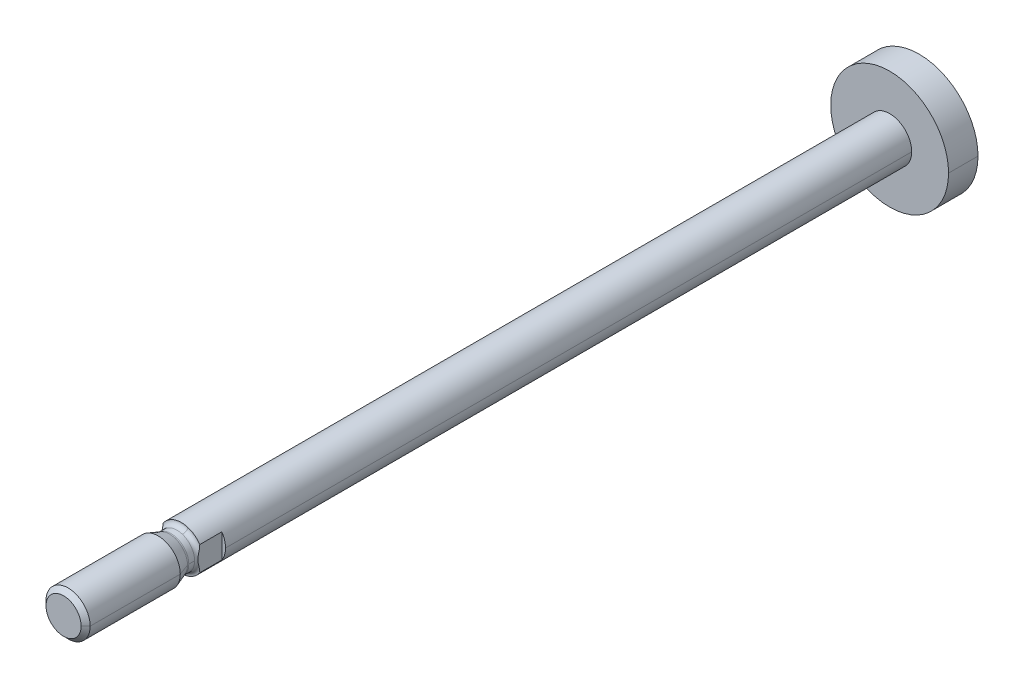
ISO-10303-21;
HEADER;
FILE_DESCRIPTION(('STEP AP214'),'2;1');
FILE_NAME('part.step','',(''),(''),'','','');
FILE_SCHEMA(('AUTOMOTIVE_DESIGN { 1 0 10303 214 1 1 1 1 }'));
ENDSEC;
DATA;
#1=APPLICATION_CONTEXT('core data for automotive mechanical design processes');
#2=APPLICATION_PROTOCOL_DEFINITION('international standard','automotive_design',2000,#1);
#3=PRODUCT_CONTEXT('',#1,'mechanical');
#4=PRODUCT('Part','Part','',(#3));
#5=PRODUCT_RELATED_PRODUCT_CATEGORY('part','',(#4));
#6=PRODUCT_DEFINITION_FORMATION('','',#4);
#7=PRODUCT_DEFINITION_CONTEXT('part definition',#1,'design');
#8=PRODUCT_DEFINITION('design','',#6,#7);
#9=PRODUCT_DEFINITION_SHAPE('','',#8);
#10=(LENGTH_UNIT() NAMED_UNIT(*) SI_UNIT(.MILLI.,.METRE.));
#11=(NAMED_UNIT(*) PLANE_ANGLE_UNIT() SI_UNIT($,.RADIAN.));
#12=(NAMED_UNIT(*) SI_UNIT($,.STERADIAN.) SOLID_ANGLE_UNIT());
#13=UNCERTAINTY_MEASURE_WITH_UNIT(LENGTH_MEASURE(1.E-05),#10,'distance_accuracy_value','');
#14=(GEOMETRIC_REPRESENTATION_CONTEXT(3) GLOBAL_UNCERTAINTY_ASSIGNED_CONTEXT((#13)) GLOBAL_UNIT_ASSIGNED_CONTEXT((#10,
#11,#12)) REPRESENTATION_CONTEXT('',''));
#15=CARTESIAN_POINT('',(0.,0.,0.));
#16=DIRECTION('',(0.,0.,1.));
#17=DIRECTION('',(1.,0.,0.));
#18=AXIS2_PLACEMENT_3D('',#15,#16,#17);
#19=CARTESIAN_POINT('',(0.,0.,-95.2));
#20=DIRECTION('',(0.,0.,-1.));
#21=DIRECTION('',(0.,1.,0.));
#22=AXIS2_PLACEMENT_3D('',#19,#20,#21);
#23=CYLINDRICAL_SURFACE('',#22,3.);
#24=DIRECTION('',(0.,0.,-1.));
#25=VECTOR('',#24,1.);
#26=CARTESIAN_POINT('',(3.,0.,2.));
#27=LINE('',#26,#25);
#28=CARTESIAN_POINT('',(3.,0.,2.));
#29=VERTEX_POINT('',#28);
#30=CARTESIAN_POINT('',(3.,0.,-91.2));
#31=VERTEX_POINT('',#30);
#32=EDGE_CURVE('E11',#29,#31,#27,.T.);
#33=ORIENTED_EDGE('',*,*,#32,.F.);
#34=CARTESIAN_POINT('',(0.,0.,2.));
#35=DIRECTION('',(0.,0.,1.));
#36=DIRECTION('',(1.,0.,0.));
#37=AXIS2_PLACEMENT_3D('',#34,#35,#36);
#38=CIRCLE('',#37,3.);
#39=CARTESIAN_POINT('',(2.5,-1.6583123951777,2.));
#40=VERTEX_POINT('',#39);
#41=EDGE_CURVE('E24',#40,#29,#38,.T.);
#42=ORIENTED_EDGE('',*,*,#41,.F.);
#43=DIRECTION('',(0.,0.,-1.));
#44=VECTOR('',#43,1.);
#45=CARTESIAN_POINT('',(2.5,-1.6583123951777,-95.2));
#46=LINE('',#45,#44);
#47=CARTESIAN_POINT('',(2.5,-1.65831239517778,4.99999999999909));
#48=VERTEX_POINT('',#47);
#49=EDGE_CURVE('E450',#48,#40,#46,.T.);
#50=ORIENTED_EDGE('',*,*,#49,.F.);
#51=CARTESIAN_POINT('',(0.,0.,5.));
#52=DIRECTION('',(0.,0.,-1.));
#53=DIRECTION('',(-1.,0.,0.));
#54=AXIS2_PLACEMENT_3D('',#51,#52,#53);
#55=CIRCLE('',#54,3.);
#56=CARTESIAN_POINT('',(-0.927050983124873,-2.85316954888556,5.));
#57=VERTEX_POINT('',#56);
#58=EDGE_CURVE('E446',#48,#57,#55,.T.);
#59=ORIENTED_EDGE('',*,*,#58,.T.);
#60=CARTESIAN_POINT('',(0.,0.,5.));
#61=DIRECTION('',(0.,0.,-1.));
#62=DIRECTION('',(-1.,0.,0.));
#63=AXIS2_PLACEMENT_3D('',#60,#61,#62);
#64=CIRCLE('',#63,3.);
#65=CARTESIAN_POINT('',(-2.5,-1.6583123951777,5.));
#66=VERTEX_POINT('',#65);
#67=EDGE_CURVE('E442',#57,#66,#64,.T.);
#68=ORIENTED_EDGE('',*,*,#67,.T.);
#69=DIRECTION('',(0.,0.,1.));
#70=VECTOR('',#69,1.);
#71=CARTESIAN_POINT('',(-2.5,-1.6583123951777,-95.2));
#72=LINE('',#71,#70);
#73=CARTESIAN_POINT('',(-2.5,-1.6583123951777,2.));
#74=VERTEX_POINT('',#73);
#75=EDGE_CURVE('E438',#74,#66,#72,.T.);
#76=ORIENTED_EDGE('',*,*,#75,.F.);
#77=CARTESIAN_POINT('',(0.,0.,2.));
#78=DIRECTION('',(0.,0.,1.));
#79=DIRECTION('',(1.,0.,0.));
#80=AXIS2_PLACEMENT_3D('',#77,#78,#79);
#81=CIRCLE('',#80,3.);
#82=CARTESIAN_POINT('',(-3.,0.,2.));
#83=VERTEX_POINT('',#82);
#84=EDGE_CURVE('E433',#83,#74,#81,.T.);
#85=ORIENTED_EDGE('',*,*,#84,.F.);
#86=DIRECTION('',(0.,0.,-1.));
#87=VECTOR('',#86,1.);
#88=CARTESIAN_POINT('',(-3.,0.,2.));
#89=LINE('',#88,#87);
#90=CARTESIAN_POINT('',(-3.,0.,-91.2));
#91=VERTEX_POINT('',#90);
#92=EDGE_CURVE('E429',#83,#91,#89,.T.);
#93=ORIENTED_EDGE('',*,*,#92,.T.);
#94=CARTESIAN_POINT('',(0.,0.,-91.2));
#95=DIRECTION('',(0.,0.,-1.));
#96=DIRECTION('',(-1.,0.,0.));
#97=AXIS2_PLACEMENT_3D('',#94,#95,#96);
#98=CIRCLE('',#97,3.);
#99=EDGE_CURVE('E424',#31,#91,#98,.T.);
#100=ORIENTED_EDGE('',*,*,#99,.F.);
#101=EDGE_LOOP('',(#33,#42,#50,#59,#68,#76,#85,#93,#100));
#102=FACE_BOUND('',#101,.T.);
#103=ADVANCED_FACE('F16',(#102),#23,.T.);
#104=CARTESIAN_POINT('',(0.,3.,-91.2));
#105=DIRECTION('',(0.,0.,-1.));
#106=DIRECTION('',(-1.,0.,0.));
#107=AXIS2_PLACEMENT_3D('',#104,#105,#106);
#108=PLANE('',#107);
#109=CARTESIAN_POINT('',(0.,0.,-91.2));
#110=DIRECTION('',(0.,0.,-1.));
#111=DIRECTION('',(-1.,0.,0.));
#112=AXIS2_PLACEMENT_3D('',#109,#110,#111);
#113=CIRCLE('',#112,8.);
#114=CARTESIAN_POINT('',(8.,0.,-91.2));
#115=VERTEX_POINT('',#114);
#116=CARTESIAN_POINT('',(-8.,0.,-91.2));
#117=VERTEX_POINT('',#116);
#118=EDGE_CURVE('E152',#115,#117,#113,.T.);
#119=ORIENTED_EDGE('',*,*,#118,.F.);
#120=CARTESIAN_POINT('',(0.,0.,-91.2));
#121=DIRECTION('',(0.,0.,-1.));
#122=DIRECTION('',(-1.,0.,0.));
#123=AXIS2_PLACEMENT_3D('',#120,#121,#122);
#124=CIRCLE('',#123,8.);
#125=EDGE_CURVE('E417',#117,#115,#124,.T.);
#126=ORIENTED_EDGE('',*,*,#125,.F.);
#127=EDGE_LOOP('',(#119,#126));
#128=FACE_BOUND('',#127,.T.);
#129=CARTESIAN_POINT('',(0.,0.,-91.2));
#130=DIRECTION('',(0.,0.,-1.));
#131=DIRECTION('',(-1.,0.,0.));
#132=AXIS2_PLACEMENT_3D('',#129,#130,#131);
#133=CIRCLE('',#132,3.);
#134=EDGE_CURVE('E412',#91,#31,#133,.T.);
#135=ORIENTED_EDGE('',*,*,#134,.T.);
#136=ORIENTED_EDGE('',*,*,#99,.T.);
#137=EDGE_LOOP('',(#135,#136));
#138=FACE_BOUND('',#137,.T.);
#139=ADVANCED_FACE('F481',(#128,#138),#108,.F.);
#140=CARTESIAN_POINT('',(0.,0.,-95.2));
#141=DIRECTION('',(0.,0.,-1.));
#142=DIRECTION('',(0.,-1.,0.));
#143=AXIS2_PLACEMENT_3D('',#140,#141,#142);
#144=CYLINDRICAL_SURFACE('',#143,3.);
#145=ORIENTED_EDGE('',*,*,#32,.T.);
#146=ORIENTED_EDGE('',*,*,#134,.F.);
#147=ORIENTED_EDGE('',*,*,#92,.F.);
#148=CARTESIAN_POINT('',(0.,0.,2.));
#149=DIRECTION('',(0.,0.,1.));
#150=DIRECTION('',(1.,0.,0.));
#151=AXIS2_PLACEMENT_3D('',#148,#149,#150);
#152=CIRCLE('',#151,3.);
#153=CARTESIAN_POINT('',(-2.5,1.6583123951777,2.));
#154=VERTEX_POINT('',#153);
#155=EDGE_CURVE('E407',#154,#83,#152,.T.);
#156=ORIENTED_EDGE('',*,*,#155,.F.);
#157=DIRECTION('',(0.,0.,-1.));
#158=VECTOR('',#157,1.);
#159=CARTESIAN_POINT('',(-2.5,1.6583123951777,-95.2));
#160=LINE('',#159,#158);
#161=CARTESIAN_POINT('',(-2.5,1.65831239517778,4.99999999999909));
#162=VERTEX_POINT('',#161);
#163=EDGE_CURVE('E402',#162,#154,#160,.T.);
#164=ORIENTED_EDGE('',*,*,#163,.F.);
#165=CARTESIAN_POINT('',(0.,0.,5.));
#166=DIRECTION('',(0.,0.,-1.));
#167=DIRECTION('',(-1.,0.,0.));
#168=AXIS2_PLACEMENT_3D('',#165,#166,#167);
#169=CIRCLE('',#168,3.);
#170=CARTESIAN_POINT('',(0.927050983124873,2.85316954888556,5.));
#171=VERTEX_POINT('',#170);
#172=EDGE_CURVE('E398',#162,#171,#169,.T.);
#173=ORIENTED_EDGE('',*,*,#172,.T.);
#174=CARTESIAN_POINT('',(0.,0.,5.));
#175=DIRECTION('',(0.,0.,-1.));
#176=DIRECTION('',(-1.,0.,0.));
#177=AXIS2_PLACEMENT_3D('',#174,#175,#176);
#178=CIRCLE('',#177,3.);
#179=CARTESIAN_POINT('',(2.5,1.6583123951777,5.));
#180=VERTEX_POINT('',#179);
#181=EDGE_CURVE('E394',#171,#180,#178,.T.);
#182=ORIENTED_EDGE('',*,*,#181,.T.);
#183=DIRECTION('',(0.,0.,1.));
#184=VECTOR('',#183,1.);
#185=CARTESIAN_POINT('',(2.5,1.6583123951777,-95.2));
#186=LINE('',#185,#184);
#187=CARTESIAN_POINT('',(2.5,1.6583123951777,2.));
#188=VERTEX_POINT('',#187);
#189=EDGE_CURVE('E390',#188,#180,#186,.T.);
#190=ORIENTED_EDGE('',*,*,#189,.F.);
#191=CARTESIAN_POINT('',(0.,0.,2.));
#192=DIRECTION('',(0.,0.,1.));
#193=DIRECTION('',(1.,0.,0.));
#194=AXIS2_PLACEMENT_3D('',#191,#192,#193);
#195=CIRCLE('',#194,3.);
#196=EDGE_CURVE('E385',#29,#188,#195,.T.);
#197=ORIENTED_EDGE('',*,*,#196,.F.);
#198=EDGE_LOOP('',(#145,#146,#147,#156,#164,#173,#182,#190,#197));
#199=FACE_BOUND('',#198,.T.);
#200=ADVANCED_FACE('F474',(#199),#144,.T.);
#201=CARTESIAN_POINT('',(0.,0.,2.));
#202=DIRECTION('',(0.,0.,1.));
#203=DIRECTION('',(1.,0.,0.));
#204=AXIS2_PLACEMENT_3D('',#201,#202,#203);
#205=PLANE('',#204);
#206=ORIENTED_EDGE('',*,*,#41,.T.);
#207=ORIENTED_EDGE('',*,*,#196,.T.);
#208=DIRECTION('',(0.,-1.,0.));
#209=VECTOR('',#208,1.);
#210=CARTESIAN_POINT('',(2.5,5.,2.));
#211=LINE('',#210,#209);
#212=EDGE_CURVE('E383',#188,#40,#211,.T.);
#213=ORIENTED_EDGE('',*,*,#212,.T.);
#214=EDGE_LOOP('',(#206,#207,#213));
#215=FACE_BOUND('',#214,.T.);
#216=ADVANCED_FACE('F363',(#215),#205,.T.);
#217=CARTESIAN_POINT('',(2.5,5.,6.));
#218=DIRECTION('',(1.,0.,0.));
#219=DIRECTION('',(0.,0.,-1.));
#220=AXIS2_PLACEMENT_3D('',#217,#218,#219);
#221=PLANE('',#220);
#222=ORIENTED_EDGE('',*,*,#49,.T.);
#223=ORIENTED_EDGE('',*,*,#212,.F.);
#224=ORIENTED_EDGE('',*,*,#189,.T.);
#225=CARTESIAN_POINT('',(2.5,1.6583123951777,5.));
#226=CARTESIAN_POINT('',(2.5,1.6350853906018,5.));
#227=CARTESIAN_POINT('',(2.5,1.61134396976878,5.00042391384695));
#228=CARTESIAN_POINT('',(2.5,1.31995088317273,5.01039632288625));
#229=CARTESIAN_POINT('',(2.5,1.0546739886757,5.06947150687412));
#230=CARTESIAN_POINT('',(2.5,0.663610870080661,5.16505629469338));
#231=CARTESIAN_POINT('',(2.5,0.532754423731142,5.1985693479185));
#232=CARTESIAN_POINT('',(2.5,0.269363705074703,5.25058170125349));
#233=CARTESIAN_POINT('',(2.5,0.1342385521877,5.26833752096453));
#234=CARTESIAN_POINT('',(2.5,-0.204088018553089,5.26833752096453));
#235=CARTESIAN_POINT('',(2.5,-0.407251135882582,5.22666008858174));
#236=CARTESIAN_POINT('',(2.5,-0.778743109144786,5.13776197891482));
#237=CARTESIAN_POINT('',(2.5,-0.952101118417445,5.09236773275344));
#238=CARTESIAN_POINT('',(2.5,-1.30127295970227,5.02408836105807));
#239=CARTESIAN_POINT('',(2.5,-1.48041983817683,4.99999999999909));
#240=CARTESIAN_POINT('',(2.5,-1.65831239517778,4.99999999999909));
#241=B_SPLINE_CURVE_WITH_KNOTS('',3,(#225,#226,#227,#228,#229,#230,#231,#232,#233,#234,#235,
#236,#237,#238,#239,#240),.UNSPECIFIED.,.F.,.F.,(4,2,2,2,2,2,2,4),(0.,0.0207399910045407,
0.260344724761913,0.380209787677685,0.500074850593456,0.682310302224486,0.841155151112243,1.),.UNSPECIFIED.);
#242=EDGE_CURVE('E381',#180,#48,#241,.T.);
#243=ORIENTED_EDGE('',*,*,#242,.T.);
#244=EDGE_LOOP('',(#222,#223,#224,#243));
#245=FACE_BOUND('',#244,.T.);
#246=ADVANCED_FACE('F358',(#245),#221,.T.);
#247=CARTESIAN_POINT('',(0.,0.,5.6000000000001));
#248=DIRECTION('',(0.,0.,-1.));
#249=DIRECTION('',(-0.951056516295154,0.309016994374947,0.));
#250=AXIS2_PLACEMENT_3D('',#247,#248,#249);
#251=TOROIDAL_SURFACE('',#250,3.0000000000001,0.600000000000099);
#252=CARTESIAN_POINT('',(-0.927050983124873,-2.85316954888556,5.6000000000001));
#253=DIRECTION('',(-0.951056516295154,0.309016994374947,0.));
#254=DIRECTION('',(0.309016994374947,0.951056516295154,-1.68753899742996E-13));
#255=AXIS2_PLACEMENT_3D('',#252,#253,#254);
#256=CIRCLE('',#255,0.600000000000099);
#257=CARTESIAN_POINT('',(-0.741640786499874,-2.28253563910837,5.6));
#258=VERTEX_POINT('',#257);
#259=EDGE_CURVE('E341',#258,#57,#256,.T.);
#260=ORIENTED_EDGE('',*,*,#259,.T.);
#261=ORIENTED_EDGE('',*,*,#58,.F.);
#262=ORIENTED_EDGE('',*,*,#242,.F.);
#263=ORIENTED_EDGE('',*,*,#181,.F.);
#264=CARTESIAN_POINT('',(0.927050983124873,2.85316954888556,5.6000000000001));
#265=DIRECTION('',(0.951056516295154,-0.309016994374947,0.));
#266=DIRECTION('',(-0.309016994374947,-0.951056516295154,-1.68753899742996E-13));
#267=AXIS2_PLACEMENT_3D('',#264,#265,#266);
#268=CIRCLE('',#267,0.600000000000099);
#269=CARTESIAN_POINT('',(0.741640786499874,2.28253563910837,5.6));
#270=VERTEX_POINT('',#269);
#271=EDGE_CURVE('E336',#270,#171,#268,.T.);
#272=ORIENTED_EDGE('',*,*,#271,.F.);
#273=CARTESIAN_POINT('',(0.,0.,5.6));
#274=DIRECTION('',(0.,0.,-1.));
#275=DIRECTION('',(-1.,0.,0.));
#276=AXIS2_PLACEMENT_3D('',#273,#274,#275);
#277=CIRCLE('',#276,2.4);
#278=CARTESIAN_POINT('',(2.4,0.,5.6));
#279=VERTEX_POINT('',#278);
#280=EDGE_CURVE('E332',#270,#279,#277,.T.);
#281=ORIENTED_EDGE('',*,*,#280,.T.);
#282=CARTESIAN_POINT('',(0.,0.,5.6));
#283=DIRECTION('',(0.,0.,-1.));
#284=DIRECTION('',(-1.,0.,0.));
#285=AXIS2_PLACEMENT_3D('',#282,#283,#284);
#286=CIRCLE('',#285,2.4);
#287=EDGE_CURVE('E328',#279,#258,#286,.T.);
#288=ORIENTED_EDGE('',*,*,#287,.T.);
#289=EDGE_LOOP('',(#260,#261,#262,#263,#272,#281,#288));
#290=FACE_BOUND('',#289,.T.);
#291=ADVANCED_FACE('F349',(#290),#251,.F.);
#292=CARTESIAN_POINT('',(0.,0.,4.));
#293=DIRECTION('',(0.,0.,-1.));
#294=DIRECTION('',(0.,1.,0.));
#295=AXIS2_PLACEMENT_3D('',#292,#293,#294);
#296=CYLINDRICAL_SURFACE('',#295,2.4);
#297=DIRECTION('',(0.,0.,-1.));
#298=VECTOR('',#297,1.);
#299=CARTESIAN_POINT('',(2.4,0.,6.3942038115749));
#300=LINE('',#299,#298);
#301=CARTESIAN_POINT('',(2.4,0.,6.3942038115749));
#302=VERTEX_POINT('',#301);
#303=EDGE_CURVE('E323',#302,#279,#300,.T.);
#304=ORIENTED_EDGE('',*,*,#303,.F.);
#305=CARTESIAN_POINT('',(0.,0.,6.3942038115749));
#306=DIRECTION('',(0.,0.,-1.));
#307=DIRECTION('',(-1.,0.,0.));
#308=AXIS2_PLACEMENT_3D('',#305,#306,#307);
#309=CIRCLE('',#308,2.4);
#310=CARTESIAN_POINT('',(-0.741640786499874,-2.28253563910837,6.3942038115749));
#311=VERTEX_POINT('',#310);
#312=EDGE_CURVE('E319',#302,#311,#309,.T.);
#313=ORIENTED_EDGE('',*,*,#312,.T.);
#314=CARTESIAN_POINT('',(0.,0.,6.3942038115749));
#315=DIRECTION('',(0.,0.,-1.));
#316=DIRECTION('',(-1.,0.,0.));
#317=AXIS2_PLACEMENT_3D('',#314,#315,#316);
#318=CIRCLE('',#317,2.4);
#319=CARTESIAN_POINT('',(-2.4,0.,6.3942038115749));
#320=VERTEX_POINT('',#319);
#321=EDGE_CURVE('E315',#311,#320,#318,.T.);
#322=ORIENTED_EDGE('',*,*,#321,.T.);
#323=DIRECTION('',(0.,0.,-1.));
#324=VECTOR('',#323,1.);
#325=CARTESIAN_POINT('',(-2.4,0.,6.3942038115749));
#326=LINE('',#325,#324);
#327=CARTESIAN_POINT('',(-2.4,0.,5.6));
#328=VERTEX_POINT('',#327);
#329=EDGE_CURVE('E311',#320,#328,#326,.T.);
#330=ORIENTED_EDGE('',*,*,#329,.T.);
#331=CARTESIAN_POINT('',(0.,0.,5.6));
#332=DIRECTION('',(0.,0.,-1.));
#333=DIRECTION('',(-1.,0.,0.));
#334=AXIS2_PLACEMENT_3D('',#331,#332,#333);
#335=CIRCLE('',#334,2.4);
#336=EDGE_CURVE('E306',#258,#328,#335,.T.);
#337=ORIENTED_EDGE('',*,*,#336,.F.);
#338=ORIENTED_EDGE('',*,*,#287,.F.);
#339=EDGE_LOOP('',(#304,#313,#322,#330,#337,#338));
#340=FACE_BOUND('',#339,.T.);
#341=ADVANCED_FACE('F283',(#340),#296,.T.);
#342=CARTESIAN_POINT('',(0.,0.,5.6000000000001));
#343=DIRECTION('',(0.,0.,-1.));
#344=DIRECTION('',(0.951056516295154,-0.309016994374947,0.));
#345=AXIS2_PLACEMENT_3D('',#342,#343,#344);
#346=TOROIDAL_SURFACE('',#345,3.0000000000001,0.600000000000099);
#347=ORIENTED_EDGE('',*,*,#259,.F.);
#348=ORIENTED_EDGE('',*,*,#336,.T.);
#349=CARTESIAN_POINT('',(0.,0.,5.6));
#350=DIRECTION('',(0.,0.,-1.));
#351=DIRECTION('',(-1.,0.,0.));
#352=AXIS2_PLACEMENT_3D('',#349,#350,#351);
#353=CIRCLE('',#352,2.4);
#354=EDGE_CURVE('E303',#328,#270,#353,.T.);
#355=ORIENTED_EDGE('',*,*,#354,.T.);
#356=ORIENTED_EDGE('',*,*,#271,.T.);
#357=ORIENTED_EDGE('',*,*,#172,.F.);
#358=CARTESIAN_POINT('',(-2.5,-1.6583123951777,5.));
#359=CARTESIAN_POINT('',(-2.5,-1.6350853906018,5.));
#360=CARTESIAN_POINT('',(-2.5,-1.61134396976878,5.00042391384695));
#361=CARTESIAN_POINT('',(-2.5,-1.31995088317273,5.01039632288625));
#362=CARTESIAN_POINT('',(-2.5,-1.0546739886757,5.06947150687412));
#363=CARTESIAN_POINT('',(-2.5,-0.663610870080661,5.16505629469338));
#364=CARTESIAN_POINT('',(-2.5,-0.532754423731142,5.1985693479185));
#365=CARTESIAN_POINT('',(-2.5,-0.269363705074703,5.25058170125349));
#366=CARTESIAN_POINT('',(-2.5,-0.1342385521877,5.26833752096453));
#367=CARTESIAN_POINT('',(-2.5,0.204088018553089,5.26833752096453));
#368=CARTESIAN_POINT('',(-2.5,0.407251135882582,5.22666008858174));
#369=CARTESIAN_POINT('',(-2.5,0.778743109144786,5.13776197891482));
#370=CARTESIAN_POINT('',(-2.5,0.952101118417445,5.09236773275343));
#371=CARTESIAN_POINT('',(-2.5,1.30127295970227,5.02408836105807));
#372=CARTESIAN_POINT('',(-2.5,1.48041983817683,4.99999999999909));
#373=CARTESIAN_POINT('',(-2.5,1.65831239517777,4.99999999999909));
#374=B_SPLINE_CURVE_WITH_KNOTS('',3,(#358,#359,#360,#361,#362,#363,#364,#365,#366,#367,#368,
#369,#370,#371,#372,#373),.UNSPECIFIED.,.F.,.F.,(4,2,2,2,2,2,2,4),(0.,0.0207399910045407,
0.260344724761913,0.380209787677685,0.500074850593456,0.682310302224486,0.841155151112243,1.),.UNSPECIFIED.);
#375=EDGE_CURVE('E301',#66,#162,#374,.T.);
#376=ORIENTED_EDGE('',*,*,#375,.F.);
#377=ORIENTED_EDGE('',*,*,#67,.F.);
#378=EDGE_LOOP('',(#347,#348,#355,#356,#357,#376,#377));
#379=FACE_BOUND('',#378,.T.);
#380=ADVANCED_FACE('F277',(#379),#346,.F.);
#381=CARTESIAN_POINT('',(-2.5,-5.,6.));
#382=DIRECTION('',(-1.,0.,0.));
#383=DIRECTION('',(0.,0.,1.));
#384=AXIS2_PLACEMENT_3D('',#381,#382,#383);
#385=PLANE('',#384);
#386=ORIENTED_EDGE('',*,*,#163,.T.);
#387=DIRECTION('',(0.,1.,0.));
#388=VECTOR('',#387,1.);
#389=CARTESIAN_POINT('',(-2.5,-5.,2.));
#390=LINE('',#389,#388);
#391=EDGE_CURVE('E257',#74,#154,#390,.T.);
#392=ORIENTED_EDGE('',*,*,#391,.F.);
#393=ORIENTED_EDGE('',*,*,#75,.T.);
#394=ORIENTED_EDGE('',*,*,#375,.T.);
#395=EDGE_LOOP('',(#386,#392,#393,#394));
#396=FACE_BOUND('',#395,.T.);
#397=ADVANCED_FACE('F266',(#396),#385,.T.);
#398=CARTESIAN_POINT('',(0.,0.,2.));
#399=DIRECTION('',(0.,0.,1.));
#400=DIRECTION('',(1.,0.,0.));
#401=AXIS2_PLACEMENT_3D('',#398,#399,#400);
#402=PLANE('',#401);
#403=ORIENTED_EDGE('',*,*,#155,.T.);
#404=ORIENTED_EDGE('',*,*,#84,.T.);
#405=ORIENTED_EDGE('',*,*,#391,.T.);
#406=EDGE_LOOP('',(#403,#404,#405));
#407=FACE_BOUND('',#406,.T.);
#408=ADVANCED_FACE('F276',(#407),#402,.T.);
#409=CARTESIAN_POINT('',(0.,0.,4.));
#410=DIRECTION('',(0.,0.,-1.));
#411=DIRECTION('',(0.,-1.,0.));
#412=AXIS2_PLACEMENT_3D('',#409,#410,#411);
#413=CYLINDRICAL_SURFACE('',#412,2.4);
#414=ORIENTED_EDGE('',*,*,#303,.T.);
#415=ORIENTED_EDGE('',*,*,#280,.F.);
#416=ORIENTED_EDGE('',*,*,#354,.F.);
#417=ORIENTED_EDGE('',*,*,#329,.F.);
#418=CARTESIAN_POINT('',(0.,0.,6.3942038115749));
#419=DIRECTION('',(0.,0.,-1.));
#420=DIRECTION('',(-1.,0.,0.));
#421=AXIS2_PLACEMENT_3D('',#418,#419,#420);
#422=CIRCLE('',#421,2.4);
#423=CARTESIAN_POINT('',(0.741640786499874,2.28253563910837,6.3942038115749));
#424=VERTEX_POINT('',#423);
#425=EDGE_CURVE('E253',#320,#424,#422,.T.);
#426=ORIENTED_EDGE('',*,*,#425,.T.);
#427=CARTESIAN_POINT('',(0.,0.,6.3942038115749));
#428=DIRECTION('',(0.,0.,-1.));
#429=DIRECTION('',(-1.,0.,0.));
#430=AXIS2_PLACEMENT_3D('',#427,#428,#429);
#431=CIRCLE('',#430,2.4);
#432=EDGE_CURVE('E248',#424,#302,#431,.T.);
#433=ORIENTED_EDGE('',*,*,#432,.T.);
#434=EDGE_LOOP('',(#414,#415,#416,#417,#426,#433));
#435=FACE_BOUND('',#434,.T.);
#436=ADVANCED_FACE('F471',(#435),#413,.T.);
#437=CARTESIAN_POINT('',(0.,0.,6.39420381157483));
#438=DIRECTION('',(0.,0.,-1.));
#439=DIRECTION('',(-0.951056516295154,0.309016994374947,0.));
#440=AXIS2_PLACEMENT_3D('',#437,#438,#439);
#441=TOROIDAL_SURFACE('',#440,2.99999999999971,0.599999999999703);
#442=CARTESIAN_POINT('',(-0.927050983124751,-2.85316954888518,6.39420381157483));
#443=DIRECTION('',(-0.951056516295154,0.309016994374947,0.));
#444=DIRECTION('',(0.290380989311547,0.893700790312812,0.342020143325949));
#445=AXIS2_PLACEMENT_3D('',#442,#443,#444);
#446=CIRCLE('',#445,0.599999999999703);
#447=CARTESIAN_POINT('',(-0.752822389537909,-2.31694907469776,6.5994158975703));
#448=VERTEX_POINT('',#447);
#449=EDGE_CURVE('E243',#448,#311,#446,.T.);
#450=ORIENTED_EDGE('',*,*,#449,.T.);
#451=ORIENTED_EDGE('',*,*,#312,.F.);
#452=ORIENTED_EDGE('',*,*,#432,.F.);
#453=CARTESIAN_POINT('',(0.927050983124751,2.85316954888518,6.39420381157483));
#454=DIRECTION('',(0.951056516295154,-0.309016994374947,0.));
#455=DIRECTION('',(-0.290380989311547,-0.893700790312811,0.342020143325951));
#456=AXIS2_PLACEMENT_3D('',#453,#454,#455);
#457=CIRCLE('',#456,0.599999999999703);
#458=CARTESIAN_POINT('',(0.752822389537909,2.31694907469776,6.5994158975703));
#459=VERTEX_POINT('',#458);
#460=EDGE_CURVE('E238',#459,#424,#457,.T.);
#461=ORIENTED_EDGE('',*,*,#460,.F.);
#462=CARTESIAN_POINT('',(0.,0.,6.5994158975703));
#463=DIRECTION('',(0.,0.,-1.));
#464=DIRECTION('',(-1.,0.,0.));
#465=AXIS2_PLACEMENT_3D('',#462,#463,#464);
#466=CIRCLE('',#465,2.4361844275285);
#467=CARTESIAN_POINT('',(2.4361844275285,0.,6.5994158975703));
#468=VERTEX_POINT('',#467);
#469=EDGE_CURVE('E234',#459,#468,#466,.T.);
#470=ORIENTED_EDGE('',*,*,#469,.T.);
#471=CARTESIAN_POINT('',(0.,0.,6.5994158975703));
#472=DIRECTION('',(0.,0.,-1.));
#473=DIRECTION('',(-1.,0.,0.));
#474=AXIS2_PLACEMENT_3D('',#471,#472,#473);
#475=CIRCLE('',#474,2.4361844275285);
#476=EDGE_CURVE('E230',#468,#448,#475,.T.);
#477=ORIENTED_EDGE('',*,*,#476,.T.);
#478=EDGE_LOOP('',(#450,#451,#452,#461,#470,#477));
#479=FACE_BOUND('',#478,.T.);
#480=ADVANCED_FACE('F571',(#479),#441,.F.);
#481=CARTESIAN_POINT('',(0.,0.,8.1484864516728));
#482=DIRECTION('',(0.,0.,1.));
#483=DIRECTION('',(0.,1.,0.));
#484=AXIS2_PLACEMENT_3D('',#481,#482,#483);
#485=CONICAL_SURFACE('',#484,3.,0.349065850398829);
#486=DIRECTION('',(-0.342020143325635,0.,0.939692620785921));
#487=VECTOR('',#486,1.);
#488=CARTESIAN_POINT('',(-2.4361844275285,0.,6.5994158975703));
#489=LINE('',#488,#487);
#490=CARTESIAN_POINT('',(-2.4361844275285,0.,6.5994158975703));
#491=VERTEX_POINT('',#490);
#492=CARTESIAN_POINT('',(-3.,0.,8.1484864516728));
#493=VERTEX_POINT('',#492);
#494=EDGE_CURVE('E225',#491,#493,#489,.T.);
#495=ORIENTED_EDGE('',*,*,#494,.F.);
#496=CARTESIAN_POINT('',(0.,0.,6.5994158975703));
#497=DIRECTION('',(0.,0.,-1.));
#498=DIRECTION('',(-1.,0.,0.));
#499=AXIS2_PLACEMENT_3D('',#496,#497,#498);
#500=CIRCLE('',#499,2.4361844275285);
#501=EDGE_CURVE('E220',#448,#491,#500,.T.);
#502=ORIENTED_EDGE('',*,*,#501,.F.);
#503=ORIENTED_EDGE('',*,*,#476,.F.);
#504=DIRECTION('',(0.342020143325635,0.,0.939692620785921));
#505=VECTOR('',#504,1.);
#506=CARTESIAN_POINT('',(2.4361844275285,0.,6.5994158975703));
#507=LINE('',#506,#505);
#508=CARTESIAN_POINT('',(3.,0.,8.1484864516728));
#509=VERTEX_POINT('',#508);
#510=EDGE_CURVE('E216',#468,#509,#507,.T.);
#511=ORIENTED_EDGE('',*,*,#510,.T.);
#512=CARTESIAN_POINT('',(0.,0.,8.1484864516728));
#513=DIRECTION('',(0.,0.,-1.));
#514=DIRECTION('',(-1.,0.,0.));
#515=AXIS2_PLACEMENT_3D('',#512,#513,#514);
#516=CIRCLE('',#515,3.);
#517=EDGE_CURVE('E212',#509,#493,#516,.T.);
#518=ORIENTED_EDGE('',*,*,#517,.T.);
#519=EDGE_LOOP('',(#495,#502,#503,#511,#518));
#520=FACE_BOUND('',#519,.T.);
#521=ADVANCED_FACE('F580',(#520),#485,.T.);
#522=CARTESIAN_POINT('',(0.,0.,4.));
#523=DIRECTION('',(0.,0.,-1.));
#524=DIRECTION('',(-1.61702923845784E-09,1.,0.));
#525=AXIS2_PLACEMENT_3D('',#522,#523,#524);
#526=CYLINDRICAL_SURFACE('',#525,3.);
#527=DIRECTION('',(0.,0.,-1.));
#528=VECTOR('',#527,1.);
#529=CARTESIAN_POINT('',(3.,0.,20.3865));
#530=LINE('',#529,#528);
#531=CARTESIAN_POINT('',(3.,0.,20.3865));
#532=VERTEX_POINT('',#531);
#533=EDGE_CURVE('E207',#532,#509,#530,.T.);
#534=ORIENTED_EDGE('',*,*,#533,.F.);
#535=CARTESIAN_POINT('',(0.,0.,20.3865));
#536=DIRECTION('',(0.,0.,-1.));
#537=DIRECTION('',(-1.,0.,0.));
#538=AXIS2_PLACEMENT_3D('',#535,#536,#537);
#539=CIRCLE('',#538,3.);
#540=CARTESIAN_POINT('',(-3.,0.,20.3865));
#541=VERTEX_POINT('',#540);
#542=EDGE_CURVE('E203',#532,#541,#539,.T.);
#543=ORIENTED_EDGE('',*,*,#542,.T.);
#544=DIRECTION('',(0.,0.,-1.));
#545=VECTOR('',#544,1.);
#546=CARTESIAN_POINT('',(-3.,0.,20.3865));
#547=LINE('',#546,#545);
#548=EDGE_CURVE('E198',#541,#493,#547,.T.);
#549=ORIENTED_EDGE('',*,*,#548,.T.);
#550=ORIENTED_EDGE('',*,*,#517,.F.);
#551=EDGE_LOOP('',(#534,#543,#549,#550));
#552=FACE_BOUND('',#551,.T.);
#553=ADVANCED_FACE('F591',(#552),#526,.T.);
#554=CARTESIAN_POINT('',(0.,0.,4.));
#555=DIRECTION('',(0.,0.,-1.));
#556=DIRECTION('',(0.,-1.,0.));
#557=AXIS2_PLACEMENT_3D('',#554,#555,#556);
#558=CYLINDRICAL_SURFACE('',#557,3.);
#559=ORIENTED_EDGE('',*,*,#533,.T.);
#560=CARTESIAN_POINT('',(0.,0.,8.1484864516728));
#561=DIRECTION('',(0.,0.,-1.));
#562=DIRECTION('',(-1.,0.,0.));
#563=AXIS2_PLACEMENT_3D('',#560,#561,#562);
#564=CIRCLE('',#563,3.);
#565=EDGE_CURVE('E193',#493,#509,#564,.T.);
#566=ORIENTED_EDGE('',*,*,#565,.F.);
#567=ORIENTED_EDGE('',*,*,#548,.F.);
#568=CARTESIAN_POINT('',(0.,0.,20.3865));
#569=DIRECTION('',(0.,0.,-1.));
#570=DIRECTION('',(-1.,0.,0.));
#571=AXIS2_PLACEMENT_3D('',#568,#569,#570);
#572=CIRCLE('',#571,3.);
#573=EDGE_CURVE('E188',#541,#532,#572,.T.);
#574=ORIENTED_EDGE('',*,*,#573,.T.);
#575=EDGE_LOOP('',(#559,#566,#567,#574));
#576=FACE_BOUND('',#575,.T.);
#577=ADVANCED_FACE('F602',(#576),#558,.T.);
#578=CARTESIAN_POINT('',(0.,0.,21.));
#579=DIRECTION('',(0.,0.,-1.));
#580=DIRECTION('',(0.,-1.,0.));
#581=AXIS2_PLACEMENT_3D('',#578,#579,#580);
#582=CONICAL_SURFACE('',#581,2.3865,0.785398163397449);
#583=DIRECTION('',(0.707106781186547,0.,-0.707106781186548));
#584=VECTOR('',#583,1.);
#585=CARTESIAN_POINT('',(2.3865,0.,21.));
#586=LINE('',#585,#584);
#587=CARTESIAN_POINT('',(2.3865,0.,21.));
#588=VERTEX_POINT('',#587);
#589=EDGE_CURVE('E183',#588,#532,#586,.T.);
#590=ORIENTED_EDGE('',*,*,#589,.T.);
#591=ORIENTED_EDGE('',*,*,#573,.F.);
#592=DIRECTION('',(-0.707106781186547,0.,-0.707106781186548));
#593=VECTOR('',#592,1.);
#594=CARTESIAN_POINT('',(-2.3865,0.,21.));
#595=LINE('',#594,#593);
#596=CARTESIAN_POINT('',(-2.3865,0.,21.));
#597=VERTEX_POINT('',#596);
#598=EDGE_CURVE('E178',#597,#541,#595,.T.);
#599=ORIENTED_EDGE('',*,*,#598,.F.);
#600=CARTESIAN_POINT('',(0.,0.,21.));
#601=DIRECTION('',(0.,0.,-1.));
#602=DIRECTION('',(-1.,0.,0.));
#603=AXIS2_PLACEMENT_3D('',#600,#601,#602);
#604=CIRCLE('',#603,2.3865);
#605=EDGE_CURVE('E174',#597,#588,#604,.T.);
#606=ORIENTED_EDGE('',*,*,#605,.T.);
#607=EDGE_LOOP('',(#590,#591,#599,#606));
#608=FACE_BOUND('',#607,.T.);
#609=ADVANCED_FACE('F613',(#608),#582,.T.);
#610=CARTESIAN_POINT('',(0.,0.,21.));
#611=DIRECTION('',(0.,0.,-1.));
#612=DIRECTION('',(-1.,0.,0.));
#613=AXIS2_PLACEMENT_3D('',#610,#611,#612);
#614=PLANE('',#613);
#615=CARTESIAN_POINT('',(0.,0.,21.));
#616=DIRECTION('',(0.,0.,-1.));
#617=DIRECTION('',(-1.,0.,0.));
#618=AXIS2_PLACEMENT_3D('',#615,#616,#617);
#619=CIRCLE('',#618,2.3865);
#620=EDGE_CURVE('E169',#588,#597,#619,.T.);
#621=ORIENTED_EDGE('',*,*,#620,.F.);
#622=ORIENTED_EDGE('',*,*,#605,.F.);
#623=EDGE_LOOP('',(#621,#622));
#624=FACE_BOUND('',#623,.T.);
#625=ADVANCED_FACE('F624',(#624),#614,.F.);
#626=CARTESIAN_POINT('',(0.,0.,21.));
#627=DIRECTION('',(0.,0.,-1.));
#628=DIRECTION('',(0.,1.,0.));
#629=AXIS2_PLACEMENT_3D('',#626,#627,#628);
#630=CONICAL_SURFACE('',#629,2.3865,0.785398163397449);
#631=ORIENTED_EDGE('',*,*,#589,.F.);
#632=ORIENTED_EDGE('',*,*,#620,.T.);
#633=ORIENTED_EDGE('',*,*,#598,.T.);
#634=ORIENTED_EDGE('',*,*,#542,.F.);
#635=EDGE_LOOP('',(#631,#632,#633,#634));
#636=FACE_BOUND('',#635,.T.);
#637=ADVANCED_FACE('F635',(#636),#630,.T.);
#638=CARTESIAN_POINT('',(0.,0.,8.1484864516728));
#639=DIRECTION('',(0.,0.,1.));
#640=DIRECTION('',(0.,-1.,0.));
#641=AXIS2_PLACEMENT_3D('',#638,#639,#640);
#642=CONICAL_SURFACE('',#641,3.,0.349065850398829);
#643=ORIENTED_EDGE('',*,*,#494,.T.);
#644=ORIENTED_EDGE('',*,*,#565,.T.);
#645=ORIENTED_EDGE('',*,*,#510,.F.);
#646=ORIENTED_EDGE('',*,*,#469,.F.);
#647=CARTESIAN_POINT('',(0.,0.,6.5994158975703));
#648=DIRECTION('',(0.,0.,-1.));
#649=DIRECTION('',(-1.,0.,0.));
#650=AXIS2_PLACEMENT_3D('',#647,#648,#649);
#651=CIRCLE('',#650,2.4361844275285);
#652=EDGE_CURVE('E164',#491,#459,#651,.T.);
#653=ORIENTED_EDGE('',*,*,#652,.F.);
#654=EDGE_LOOP('',(#643,#644,#645,#646,#653));
#655=FACE_BOUND('',#654,.T.);
#656=ADVANCED_FACE('F646',(#655),#642,.T.);
#657=CARTESIAN_POINT('',(0.,0.,6.39420381157483));
#658=DIRECTION('',(0.,0.,-1.));
#659=DIRECTION('',(0.951056516295154,-0.309016994374947,0.));
#660=AXIS2_PLACEMENT_3D('',#657,#658,#659);
#661=TOROIDAL_SURFACE('',#660,2.99999999999971,0.599999999999703);
#662=ORIENTED_EDGE('',*,*,#449,.F.);
#663=ORIENTED_EDGE('',*,*,#501,.T.);
#664=ORIENTED_EDGE('',*,*,#652,.T.);
#665=ORIENTED_EDGE('',*,*,#460,.T.);
#666=ORIENTED_EDGE('',*,*,#425,.F.);
#667=ORIENTED_EDGE('',*,*,#321,.F.);
#668=EDGE_LOOP('',(#662,#663,#664,#665,#666,#667));
#669=FACE_BOUND('',#668,.T.);
#670=ADVANCED_FACE('F657',(#669),#661,.F.);
#671=CARTESIAN_POINT('',(0.,0.,-95.2));
#672=DIRECTION('',(0.,0.,-1.));
#673=DIRECTION('',(0.,-1.,0.));
#674=AXIS2_PLACEMENT_3D('',#671,#672,#673);
#675=CYLINDRICAL_SURFACE('',#674,8.);
#676=DIRECTION('',(0.,0.,-1.));
#677=VECTOR('',#676,1.);
#678=CARTESIAN_POINT('',(8.,0.,-91.2));
#679=LINE('',#678,#677);
#680=CARTESIAN_POINT('',(8.,0.,-95.2));
#681=VERTEX_POINT('',#680);
#682=EDGE_CURVE('E144',#115,#681,#679,.T.);
#683=ORIENTED_EDGE('',*,*,#682,.T.);
#684=CARTESIAN_POINT('',(0.,0.,-95.2));
#685=DIRECTION('',(0.,0.,-1.));
#686=DIRECTION('',(-1.,0.,0.));
#687=AXIS2_PLACEMENT_3D('',#684,#685,#686);
#688=CIRCLE('',#687,8.);
#689=CARTESIAN_POINT('',(-8.,0.,-95.2));
#690=VERTEX_POINT('',#689);
#691=EDGE_CURVE('E137',#690,#681,#688,.T.);
#692=ORIENTED_EDGE('',*,*,#691,.F.);
#693=DIRECTION('',(0.,0.,-1.));
#694=VECTOR('',#693,1.);
#695=CARTESIAN_POINT('',(-8.,0.,-91.2));
#696=LINE('',#695,#694);
#697=EDGE_CURVE('E141',#117,#690,#696,.T.);
#698=ORIENTED_EDGE('',*,*,#697,.F.);
#699=ORIENTED_EDGE('',*,*,#125,.T.);
#700=EDGE_LOOP('',(#683,#692,#698,#699));
#701=FACE_BOUND('',#700,.T.);
#702=ADVANCED_FACE('F139',(#701),#675,.T.);
#703=CARTESIAN_POINT('',(0.,0.,-95.2));
#704=DIRECTION('',(0.,0.,-1.));
#705=DIRECTION('',(0.,1.,0.));
#706=AXIS2_PLACEMENT_3D('',#703,#704,#705);
#707=CYLINDRICAL_SURFACE('',#706,8.);
#708=ORIENTED_EDGE('',*,*,#682,.F.);
#709=ORIENTED_EDGE('',*,*,#118,.T.);
#710=ORIENTED_EDGE('',*,*,#697,.T.);
#711=CARTESIAN_POINT('',(0.,0.,-95.2));
#712=DIRECTION('',(0.,0.,-1.));
#713=DIRECTION('',(-1.,0.,0.));
#714=AXIS2_PLACEMENT_3D('',#711,#712,#713);
#715=CIRCLE('',#714,8.);
#716=EDGE_CURVE('E151',#681,#690,#715,.T.);
#717=ORIENTED_EDGE('',*,*,#716,.F.);
#718=EDGE_LOOP('',(#708,#709,#710,#717));
#719=FACE_BOUND('',#718,.T.);
#720=ADVANCED_FACE('F150',(#719),#707,.T.);
#721=CARTESIAN_POINT('',(0.,8.,-95.2));
#722=DIRECTION('',(0.,0.,1.));
#723=DIRECTION('',(1.,0.,0.));
#724=AXIS2_PLACEMENT_3D('',#721,#722,#723);
#725=PLANE('',#724);
#726=ORIENTED_EDGE('',*,*,#691,.T.);
#727=ORIENTED_EDGE('',*,*,#716,.T.);
#728=EDGE_LOOP('',(#726,#727));
#729=FACE_BOUND('',#728,.T.);
#730=ADVANCED_FACE('F154',(#729),#725,.F.);
#731=CLOSED_SHELL('',(#103,#139,#200,#216,#246,#291,#341,#380,#397,#408,#436,#480,#521,#553,
#577,#609,#625,#637,#656,#670,#702,#720,#730));
#732=MANIFOLD_SOLID_BREP('B1',#731);
#733=ADVANCED_BREP_SHAPE_REPRESENTATION('',(#18,#732),#14);
#734=SHAPE_DEFINITION_REPRESENTATION(#9,#733);
ENDSEC;
END-ISO-10303-21;
